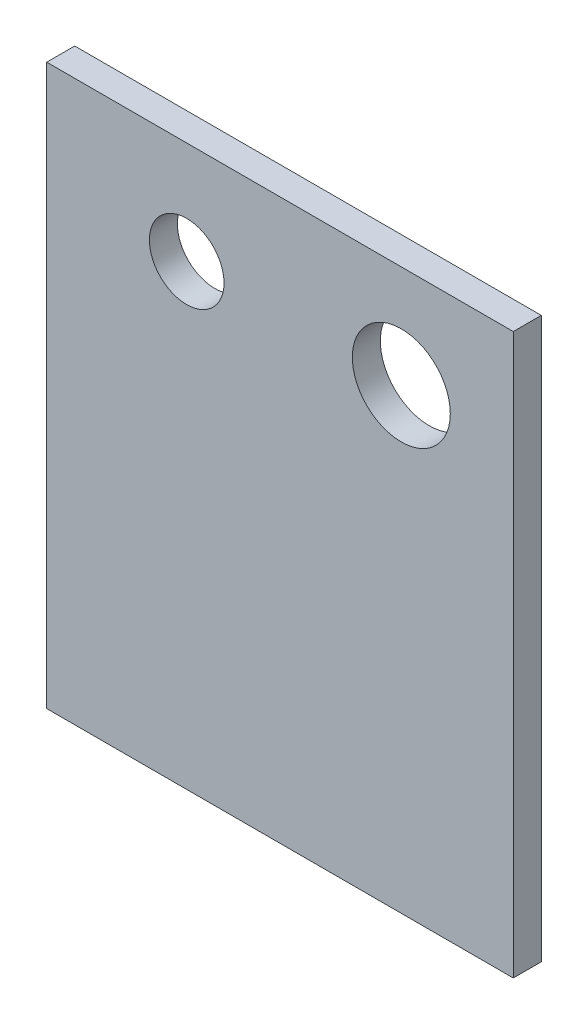
ISO-10303-21;
HEADER;
FILE_DESCRIPTION(('STEP AP214'),'2;1');
FILE_NAME('part.step','',(''),(''),'','','');
FILE_SCHEMA(('AUTOMOTIVE_DESIGN { 1 0 10303 214 1 1 1 1 }'));
ENDSEC;
DATA;
#1=APPLICATION_CONTEXT('core data for automotive mechanical design processes');
#2=APPLICATION_PROTOCOL_DEFINITION('international standard','automotive_design',2000,#1);
#3=PRODUCT_CONTEXT('',#1,'mechanical');
#4=PRODUCT('Part','Part','',(#3));
#5=PRODUCT_RELATED_PRODUCT_CATEGORY('part','',(#4));
#6=PRODUCT_DEFINITION_FORMATION('','',#4);
#7=PRODUCT_DEFINITION_CONTEXT('part definition',#1,'design');
#8=PRODUCT_DEFINITION('design','',#6,#7);
#9=PRODUCT_DEFINITION_SHAPE('','',#8);
#10=(LENGTH_UNIT() NAMED_UNIT(*) SI_UNIT(.MILLI.,.METRE.));
#11=(NAMED_UNIT(*) PLANE_ANGLE_UNIT() SI_UNIT($,.RADIAN.));
#12=(NAMED_UNIT(*) SI_UNIT($,.STERADIAN.) SOLID_ANGLE_UNIT());
#13=UNCERTAINTY_MEASURE_WITH_UNIT(LENGTH_MEASURE(1.E-05),#10,'distance_accuracy_value','');
#14=(GEOMETRIC_REPRESENTATION_CONTEXT(3) GLOBAL_UNCERTAINTY_ASSIGNED_CONTEXT((#13)) GLOBAL_UNIT_ASSIGNED_CONTEXT((#10,
#11,#12)) REPRESENTATION_CONTEXT('',''));
#15=CARTESIAN_POINT('',(0.,0.,0.));
#16=DIRECTION('',(0.,0.,1.));
#17=DIRECTION('',(1.,0.,0.));
#18=AXIS2_PLACEMENT_3D('',#15,#16,#17);
#19=CARTESIAN_POINT('',(0.,0.,3.));
#20=DIRECTION('',(0.,0.,-1.));
#21=DIRECTION('',(-1.,0.,0.));
#22=AXIS2_PLACEMENT_3D('',#19,#20,#21);
#23=PLANE('',#22);
#24=CARTESIAN_POINT('',(13.,19.,3.));
#25=DIRECTION('',(0.,0.,1.));
#26=DIRECTION('',(1.,0.,0.));
#27=AXIS2_PLACEMENT_3D('',#24,#25,#26);
#28=CIRCLE('',#27,5.25);
#29=CARTESIAN_POINT('',(18.25,19.,3.));
#30=VERTEX_POINT('',#29);
#31=EDGE_CURVE('E117',#30,#30,#28,.T.);
#32=ORIENTED_EDGE('',*,*,#31,.F.);
#33=EDGE_LOOP('',(#32));
#34=FACE_BOUND('',#33,.T.);
#35=DIRECTION('',(0.,1.,0.));
#36=VECTOR('',#35,1.);
#37=CARTESIAN_POINT('',(25.,-30.,3.));
#38=LINE('',#37,#36);
#39=CARTESIAN_POINT('',(25.,-30.,3.));
#40=VERTEX_POINT('',#39);
#41=CARTESIAN_POINT('',(25.,30.,3.));
#42=VERTEX_POINT('',#41);
#43=EDGE_CURVE('E87',#40,#42,#38,.T.);
#44=ORIENTED_EDGE('',*,*,#43,.T.);
#45=DIRECTION('',(-1.,0.,0.));
#46=VECTOR('',#45,1.);
#47=CARTESIAN_POINT('',(-25.,30.,3.));
#48=LINE('',#47,#46);
#49=CARTESIAN_POINT('',(-25.,30.,3.));
#50=VERTEX_POINT('',#49);
#51=EDGE_CURVE('E82',#42,#50,#48,.T.);
#52=ORIENTED_EDGE('',*,*,#51,.T.);
#53=DIRECTION('',(0.,-1.,0.));
#54=VECTOR('',#53,1.);
#55=CARTESIAN_POINT('',(-25.,-30.,3.));
#56=LINE('',#55,#54);
#57=CARTESIAN_POINT('',(-25.,-30.,3.));
#58=VERTEX_POINT('',#57);
#59=EDGE_CURVE('E85',#50,#58,#56,.T.);
#60=ORIENTED_EDGE('',*,*,#59,.T.);
#61=DIRECTION('',(1.,0.,0.));
#62=VECTOR('',#61,1.);
#63=CARTESIAN_POINT('',(-25.,-30.,3.));
#64=LINE('',#63,#62);
#65=EDGE_CURVE('E52',#58,#40,#64,.T.);
#66=ORIENTED_EDGE('',*,*,#65,.T.);
#67=EDGE_LOOP('',(#44,#52,#60,#66));
#68=FACE_BOUND('',#67,.T.);
#69=CARTESIAN_POINT('',(-10.,19.,3.));
#70=DIRECTION('',(0.,0.,1.));
#71=DIRECTION('',(1.,0.,0.));
#72=AXIS2_PLACEMENT_3D('',#69,#70,#71);
#73=CIRCLE('',#72,4.);
#74=CARTESIAN_POINT('',(-6.,19.,3.));
#75=VERTEX_POINT('',#74);
#76=EDGE_CURVE('E102',#75,#75,#73,.T.);
#77=ORIENTED_EDGE('',*,*,#76,.F.);
#78=EDGE_LOOP('',(#77));
#79=FACE_BOUND('',#78,.T.);
#80=ADVANCED_FACE('F35',(#34,#68,#79),#23,.F.);
#81=CARTESIAN_POINT('',(0.,0.,0.));
#82=DIRECTION('',(0.,0.,-1.));
#83=DIRECTION('',(-1.,0.,0.));
#84=AXIS2_PLACEMENT_3D('',#81,#82,#83);
#85=PLANE('',#84);
#86=CARTESIAN_POINT('',(13.,19.,0.));
#87=DIRECTION('',(0.,0.,1.));
#88=DIRECTION('',(1.,0.,0.));
#89=AXIS2_PLACEMENT_3D('',#86,#87,#88);
#90=CIRCLE('',#89,5.25);
#91=CARTESIAN_POINT('',(18.25,19.,0.));
#92=VERTEX_POINT('',#91);
#93=EDGE_CURVE('E120',#92,#92,#90,.T.);
#94=ORIENTED_EDGE('',*,*,#93,.T.);
#95=EDGE_LOOP('',(#94));
#96=FACE_BOUND('',#95,.T.);
#97=DIRECTION('',(0.,1.,0.));
#98=VECTOR('',#97,1.);
#99=CARTESIAN_POINT('',(25.,-30.,0.));
#100=LINE('',#99,#98);
#101=CARTESIAN_POINT('',(25.,-30.,0.));
#102=VERTEX_POINT('',#101);
#103=CARTESIAN_POINT('',(25.,30.,0.));
#104=VERTEX_POINT('',#103);
#105=EDGE_CURVE('E99',#102,#104,#100,.T.);
#106=ORIENTED_EDGE('',*,*,#105,.F.);
#107=DIRECTION('',(1.,0.,0.));
#108=VECTOR('',#107,1.);
#109=CARTESIAN_POINT('',(-25.,-30.,0.));
#110=LINE('',#109,#108);
#111=CARTESIAN_POINT('',(-25.,-30.,0.));
#112=VERTEX_POINT('',#111);
#113=EDGE_CURVE('E75',#112,#102,#110,.T.);
#114=ORIENTED_EDGE('',*,*,#113,.F.);
#115=DIRECTION('',(0.,-1.,0.));
#116=VECTOR('',#115,1.);
#117=CARTESIAN_POINT('',(-25.,-30.,0.));
#118=LINE('',#117,#116);
#119=CARTESIAN_POINT('',(-25.,30.,0.));
#120=VERTEX_POINT('',#119);
#121=EDGE_CURVE('E69',#120,#112,#118,.T.);
#122=ORIENTED_EDGE('',*,*,#121,.F.);
#123=DIRECTION('',(-1.,0.,0.));
#124=VECTOR('',#123,1.);
#125=CARTESIAN_POINT('',(-25.,30.,0.));
#126=LINE('',#125,#124);
#127=EDGE_CURVE('E91',#104,#120,#126,.T.);
#128=ORIENTED_EDGE('',*,*,#127,.F.);
#129=EDGE_LOOP('',(#106,#114,#122,#128));
#130=FACE_BOUND('',#129,.T.);
#131=CARTESIAN_POINT('',(-10.,19.,0.));
#132=DIRECTION('',(0.,0.,1.));
#133=DIRECTION('',(1.,0.,0.));
#134=AXIS2_PLACEMENT_3D('',#131,#132,#133);
#135=CIRCLE('',#134,4.);
#136=CARTESIAN_POINT('',(-6.,19.,0.));
#137=VERTEX_POINT('',#136);
#138=EDGE_CURVE('E114',#137,#137,#135,.T.);
#139=ORIENTED_EDGE('',*,*,#138,.T.);
#140=EDGE_LOOP('',(#139));
#141=FACE_BOUND('',#140,.T.);
#142=ADVANCED_FACE('F110',(#96,#130,#141),#85,.T.);
#143=CARTESIAN_POINT('',(25.,-30.,3.));
#144=DIRECTION('',(-1.,0.,0.));
#145=DIRECTION('',(0.,0.,1.));
#146=AXIS2_PLACEMENT_3D('',#143,#144,#145);
#147=PLANE('',#146);
#148=ORIENTED_EDGE('',*,*,#105,.T.);
#149=DIRECTION('',(0.,0.,-1.));
#150=VECTOR('',#149,1.);
#151=CARTESIAN_POINT('',(25.,30.,3.));
#152=LINE('',#151,#150);
#153=EDGE_CURVE('E11',#42,#104,#152,.T.);
#154=ORIENTED_EDGE('',*,*,#153,.F.);
#155=ORIENTED_EDGE('',*,*,#43,.F.);
#156=DIRECTION('',(0.,0.,-1.));
#157=VECTOR('',#156,1.);
#158=CARTESIAN_POINT('',(25.,-30.,3.));
#159=LINE('',#158,#157);
#160=EDGE_CURVE('E95',#40,#102,#159,.T.);
#161=ORIENTED_EDGE('',*,*,#160,.T.);
#162=EDGE_LOOP('',(#148,#154,#155,#161));
#163=FACE_BOUND('',#162,.T.);
#164=ADVANCED_FACE('F37',(#163),#147,.F.);
#165=CARTESIAN_POINT('',(-25.,30.,3.));
#166=DIRECTION('',(0.,-1.,0.));
#167=DIRECTION('',(0.,0.,-1.));
#168=AXIS2_PLACEMENT_3D('',#165,#166,#167);
#169=PLANE('',#168);
#170=ORIENTED_EDGE('',*,*,#127,.T.);
#171=DIRECTION('',(0.,0.,-1.));
#172=VECTOR('',#171,1.);
#173=CARTESIAN_POINT('',(-25.,30.,3.));
#174=LINE('',#173,#172);
#175=EDGE_CURVE('E44',#50,#120,#174,.T.);
#176=ORIENTED_EDGE('',*,*,#175,.F.);
#177=ORIENTED_EDGE('',*,*,#51,.F.);
#178=ORIENTED_EDGE('',*,*,#153,.T.);
#179=EDGE_LOOP('',(#170,#176,#177,#178));
#180=FACE_BOUND('',#179,.T.);
#181=ADVANCED_FACE('F90',(#180),#169,.F.);
#182=CARTESIAN_POINT('',(-25.,-30.,3.));
#183=DIRECTION('',(1.,0.,0.));
#184=DIRECTION('',(0.,0.,-1.));
#185=AXIS2_PLACEMENT_3D('',#182,#183,#184);
#186=PLANE('',#185);
#187=ORIENTED_EDGE('',*,*,#121,.T.);
#188=DIRECTION('',(0.,0.,-1.));
#189=VECTOR('',#188,1.);
#190=CARTESIAN_POINT('',(-25.,-30.,3.));
#191=LINE('',#190,#189);
#192=EDGE_CURVE('E92',#58,#112,#191,.T.);
#193=ORIENTED_EDGE('',*,*,#192,.F.);
#194=ORIENTED_EDGE('',*,*,#59,.F.);
#195=ORIENTED_EDGE('',*,*,#175,.T.);
#196=EDGE_LOOP('',(#187,#193,#194,#195));
#197=FACE_BOUND('',#196,.T.);
#198=ADVANCED_FACE('F93',(#197),#186,.F.);
#199=CARTESIAN_POINT('',(-25.,-30.,3.));
#200=DIRECTION('',(0.,1.,0.));
#201=DIRECTION('',(0.,0.,1.));
#202=AXIS2_PLACEMENT_3D('',#199,#200,#201);
#203=PLANE('',#202);
#204=ORIENTED_EDGE('',*,*,#113,.T.);
#205=ORIENTED_EDGE('',*,*,#160,.F.);
#206=ORIENTED_EDGE('',*,*,#65,.F.);
#207=ORIENTED_EDGE('',*,*,#192,.T.);
#208=EDGE_LOOP('',(#204,#205,#206,#207));
#209=FACE_BOUND('',#208,.T.);
#210=ADVANCED_FACE('F107',(#209),#203,.F.);
#211=CARTESIAN_POINT('',(-10.,19.,3.));
#212=DIRECTION('',(0.,0.,-1.));
#213=DIRECTION('',(-1.,0.,0.));
#214=AXIS2_PLACEMENT_3D('',#211,#212,#213);
#215=CYLINDRICAL_SURFACE('',#214,4.);
#216=ORIENTED_EDGE('',*,*,#76,.T.);
#217=EDGE_LOOP('',(#216));
#218=FACE_BOUND('',#217,.T.);
#219=ORIENTED_EDGE('',*,*,#138,.F.);
#220=EDGE_LOOP('',(#219));
#221=FACE_BOUND('',#220,.T.);
#222=ADVANCED_FACE('F138',(#218,#221),#215,.F.);
#223=CARTESIAN_POINT('',(13.,19.,3.));
#224=DIRECTION('',(0.,0.,-1.));
#225=DIRECTION('',(-1.,0.,0.));
#226=AXIS2_PLACEMENT_3D('',#223,#224,#225);
#227=CYLINDRICAL_SURFACE('',#226,5.25);
#228=ORIENTED_EDGE('',*,*,#31,.T.);
#229=EDGE_LOOP('',(#228));
#230=FACE_BOUND('',#229,.T.);
#231=ORIENTED_EDGE('',*,*,#93,.F.);
#232=EDGE_LOOP('',(#231));
#233=FACE_BOUND('',#232,.T.);
#234=ADVANCED_FACE('F126',(#230,#233),#227,.F.);
#235=CLOSED_SHELL('',(#80,#142,#164,#181,#198,#210,#222,#234));
#236=MANIFOLD_SOLID_BREP('B2',#235);
#237=ADVANCED_BREP_SHAPE_REPRESENTATION('',(#18,#236),#14);
#238=SHAPE_DEFINITION_REPRESENTATION(#9,#237);
ENDSEC;
END-ISO-10303-21;
